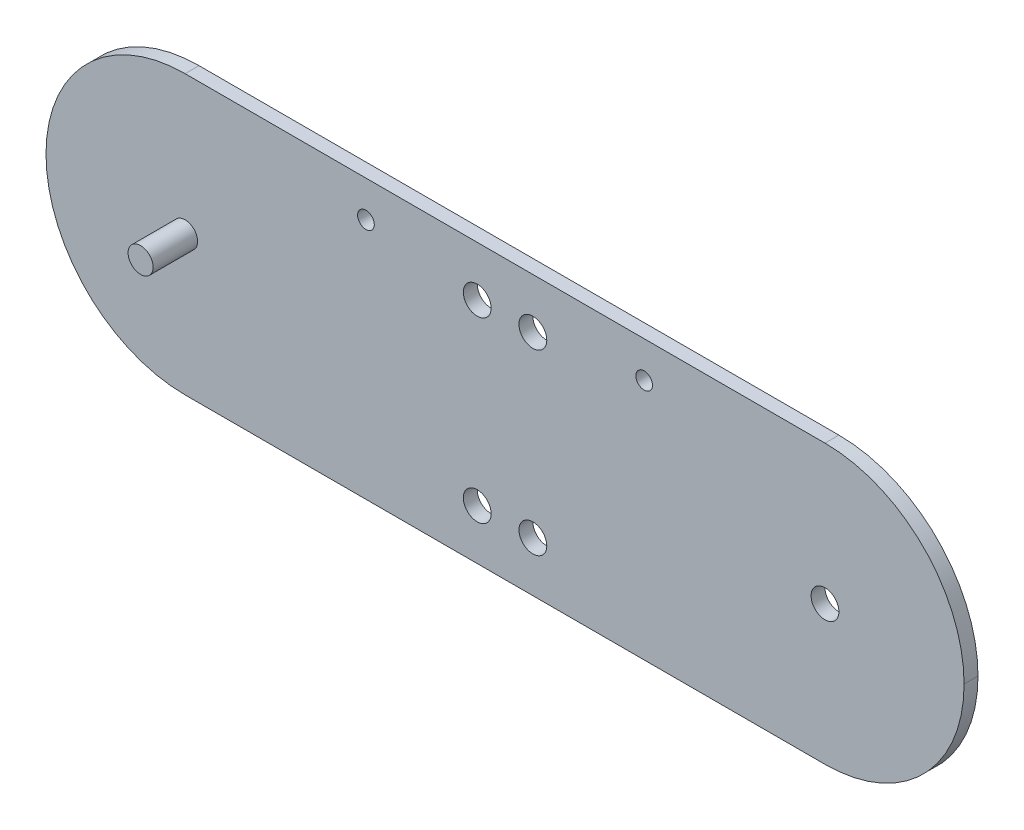
ISO-10303-21;
HEADER;
FILE_DESCRIPTION(('STEP AP214'),'2;1');
FILE_NAME('part.step','',(''),(''),'','','');
FILE_SCHEMA(('AUTOMOTIVE_DESIGN { 1 0 10303 214 1 1 1 1 }'));
ENDSEC;
DATA;
#1=APPLICATION_CONTEXT('core data for automotive mechanical design processes');
#2=APPLICATION_PROTOCOL_DEFINITION('international standard','automotive_design',2000,#1);
#3=PRODUCT_CONTEXT('',#1,'mechanical');
#4=PRODUCT('Part','Part','',(#3));
#5=PRODUCT_RELATED_PRODUCT_CATEGORY('part','',(#4));
#6=PRODUCT_DEFINITION_FORMATION('','',#4);
#7=PRODUCT_DEFINITION_CONTEXT('part definition',#1,'design');
#8=PRODUCT_DEFINITION('design','',#6,#7);
#9=PRODUCT_DEFINITION_SHAPE('','',#8);
#10=(LENGTH_UNIT() NAMED_UNIT(*) SI_UNIT(.MILLI.,.METRE.));
#11=(NAMED_UNIT(*) PLANE_ANGLE_UNIT() SI_UNIT($,.RADIAN.));
#12=(NAMED_UNIT(*) SI_UNIT($,.STERADIAN.) SOLID_ANGLE_UNIT());
#13=UNCERTAINTY_MEASURE_WITH_UNIT(LENGTH_MEASURE(1.E-05),#10,'distance_accuracy_value','');
#14=(GEOMETRIC_REPRESENTATION_CONTEXT(3) GLOBAL_UNCERTAINTY_ASSIGNED_CONTEXT((#13)) GLOBAL_UNIT_ASSIGNED_CONTEXT((#10,
#11,#12)) REPRESENTATION_CONTEXT('',''));
#15=CARTESIAN_POINT('',(0.,0.,0.));
#16=DIRECTION('',(0.,0.,1.));
#17=DIRECTION('',(1.,0.,0.));
#18=AXIS2_PLACEMENT_3D('',#15,#16,#17);
#19=CARTESIAN_POINT('',(82.5,-25.,2.5));
#20=DIRECTION('',(0.,1.,0.));
#21=DIRECTION('',(-1.,0.,0.));
#22=AXIS2_PLACEMENT_3D('',#19,#20,#21);
#23=PLANE('',#22);
#24=DIRECTION('',(1.,0.,0.));
#25=VECTOR('',#24,1.);
#26=CARTESIAN_POINT('',(82.5,-25.,2.5));
#27=LINE('',#26,#25);
#28=CARTESIAN_POINT('',(-57.5,-25.,2.5));
#29=VERTEX_POINT('',#28);
#30=CARTESIAN_POINT('',(57.5,-25.,2.5));
#31=VERTEX_POINT('',#30);
#32=EDGE_CURVE('E112',#29,#31,#27,.T.);
#33=ORIENTED_EDGE('',*,*,#32,.F.);
#34=DIRECTION('',(0.,0.,-1.));
#35=VECTOR('',#34,1.);
#36=CARTESIAN_POINT('',(-57.5,-25.,2.5));
#37=LINE('',#36,#35);
#38=CARTESIAN_POINT('',(-57.5,-25.,0.));
#39=VERTEX_POINT('',#38);
#40=EDGE_CURVE('E97',#29,#39,#37,.T.);
#41=ORIENTED_EDGE('',*,*,#40,.T.);
#42=DIRECTION('',(1.,0.,0.));
#43=VECTOR('',#42,1.);
#44=CARTESIAN_POINT('',(82.5,-25.,0.));
#45=LINE('',#44,#43);
#46=CARTESIAN_POINT('',(57.5,-25.,0.));
#47=VERTEX_POINT('',#46);
#48=EDGE_CURVE('E109',#39,#47,#45,.T.);
#49=ORIENTED_EDGE('',*,*,#48,.T.);
#50=DIRECTION('',(0.,0.,-1.));
#51=VECTOR('',#50,1.);
#52=CARTESIAN_POINT('',(57.5,-25.,2.5));
#53=LINE('',#52,#51);
#54=EDGE_CURVE('E114',#47,#31,#53,.F.);
#55=ORIENTED_EDGE('',*,*,#54,.T.);
#56=EDGE_LOOP('',(#33,#41,#49,#55));
#57=FACE_BOUND('',#56,.T.);
#58=ADVANCED_FACE('F40',(#57),#23,.F.);
#59=CARTESIAN_POINT('',(82.5,25.,2.5));
#60=DIRECTION('',(0.,-1.,0.));
#61=DIRECTION('',(1.,0.,0.));
#62=AXIS2_PLACEMENT_3D('',#59,#60,#61);
#63=PLANE('',#62);
#64=DIRECTION('',(-1.,0.,0.));
#65=VECTOR('',#64,1.);
#66=CARTESIAN_POINT('',(82.5,25.,0.));
#67=LINE('',#66,#65);
#68=CARTESIAN_POINT('',(57.5,25.,0.));
#69=VERTEX_POINT('',#68);
#70=CARTESIAN_POINT('',(-57.5,25.,0.));
#71=VERTEX_POINT('',#70);
#72=EDGE_CURVE('E119',#69,#71,#67,.T.);
#73=ORIENTED_EDGE('',*,*,#72,.T.);
#74=DIRECTION('',(0.,0.,-1.));
#75=VECTOR('',#74,1.);
#76=CARTESIAN_POINT('',(-57.5,25.,2.5));
#77=LINE('',#76,#75);
#78=CARTESIAN_POINT('',(-57.5,25.,2.5));
#79=VERTEX_POINT('',#78);
#80=EDGE_CURVE('E48',#71,#79,#77,.F.);
#81=ORIENTED_EDGE('',*,*,#80,.T.);
#82=DIRECTION('',(-1.,0.,0.));
#83=VECTOR('',#82,1.);
#84=CARTESIAN_POINT('',(82.5,25.,2.5));
#85=LINE('',#84,#83);
#86=CARTESIAN_POINT('',(57.5,25.,2.5));
#87=VERTEX_POINT('',#86);
#88=EDGE_CURVE('E125',#87,#79,#85,.T.);
#89=ORIENTED_EDGE('',*,*,#88,.F.);
#90=DIRECTION('',(0.,0.,-1.));
#91=VECTOR('',#90,1.);
#92=CARTESIAN_POINT('',(57.5,25.,2.5));
#93=LINE('',#92,#91);
#94=EDGE_CURVE('E139',#87,#69,#93,.T.);
#95=ORIENTED_EDGE('',*,*,#94,.T.);
#96=EDGE_LOOP('',(#73,#81,#89,#95));
#97=FACE_BOUND('',#96,.T.);
#98=ADVANCED_FACE('F169',(#97),#63,.F.);
#99=CARTESIAN_POINT('',(0.,0.,2.5));
#100=DIRECTION('',(0.,0.,-1.));
#101=DIRECTION('',(-1.,0.,0.));
#102=AXIS2_PLACEMENT_3D('',#99,#100,#101);
#103=PLANE('',#102);
#104=CARTESIAN_POINT('',(25.,18.5,2.5));
#105=DIRECTION('',(0.,0.,-1.));
#106=DIRECTION('',(-1.,0.,0.));
#107=AXIS2_PLACEMENT_3D('',#104,#105,#106);
#108=CIRCLE('',#107,1.5);
#109=CARTESIAN_POINT('',(23.5,18.5,2.5));
#110=VERTEX_POINT('',#109);
#111=EDGE_CURVE('E241',#110,#110,#108,.T.);
#112=ORIENTED_EDGE('',*,*,#111,.T.);
#113=EDGE_LOOP('',(#112));
#114=FACE_BOUND('',#113,.T.);
#115=CARTESIAN_POINT('',(-25.,18.5,2.5));
#116=DIRECTION('',(0.,0.,-1.));
#117=DIRECTION('',(-1.,0.,0.));
#118=AXIS2_PLACEMENT_3D('',#115,#116,#117);
#119=CIRCLE('',#118,1.5);
#120=CARTESIAN_POINT('',(-26.5,18.5,2.5));
#121=VERTEX_POINT('',#120);
#122=EDGE_CURVE('E243',#121,#121,#119,.T.);
#123=ORIENTED_EDGE('',*,*,#122,.T.);
#124=EDGE_LOOP('',(#123));
#125=FACE_BOUND('',#124,.T.);
#126=CARTESIAN_POINT('',(-57.5,0.,2.5));
#127=DIRECTION('',(0.,0.,-1.));
#128=DIRECTION('',(-1.,0.,0.));
#129=AXIS2_PLACEMENT_3D('',#126,#127,#128);
#130=CIRCLE('',#129,2.25);
#131=CARTESIAN_POINT('',(-59.75,0.,2.5));
#132=VERTEX_POINT('',#131);
#133=EDGE_CURVE('E12',#132,#132,#130,.F.);
#134=ORIENTED_EDGE('',*,*,#133,.F.);
#135=EDGE_LOOP('',(#134));
#136=FACE_BOUND('',#135,.T.);
#137=CARTESIAN_POINT('',(57.5,0.,2.5));
#138=DIRECTION('',(0.,0.,-1.));
#139=DIRECTION('',(-1.,0.,0.));
#140=AXIS2_PLACEMENT_3D('',#137,#138,#139);
#141=CIRCLE('',#140,2.5);
#142=CARTESIAN_POINT('',(55.,0.,2.5));
#143=VERTEX_POINT('',#142);
#144=EDGE_CURVE('E252',#143,#143,#141,.T.);
#145=ORIENTED_EDGE('',*,*,#144,.T.);
#146=EDGE_LOOP('',(#145));
#147=FACE_BOUND('',#146,.T.);
#148=CARTESIAN_POINT('',(-5.,-16.,2.5));
#149=DIRECTION('',(0.,0.,-1.));
#150=DIRECTION('',(1.,0.,0.));
#151=AXIS2_PLACEMENT_3D('',#148,#149,#150);
#152=CIRCLE('',#151,2.5);
#153=CARTESIAN_POINT('',(-2.5,-16.,2.5));
#154=VERTEX_POINT('',#153);
#155=EDGE_CURVE('E259',#154,#154,#152,.T.);
#156=ORIENTED_EDGE('',*,*,#155,.T.);
#157=EDGE_LOOP('',(#156));
#158=FACE_BOUND('',#157,.T.);
#159=CARTESIAN_POINT('',(5.,-16.,2.5));
#160=DIRECTION('',(0.,0.,-1.));
#161=DIRECTION('',(1.,0.,0.));
#162=AXIS2_PLACEMENT_3D('',#159,#160,#161);
#163=CIRCLE('',#162,2.5);
#164=CARTESIAN_POINT('',(7.5,-16.,2.5));
#165=VERTEX_POINT('',#164);
#166=EDGE_CURVE('E154',#165,#165,#163,.T.);
#167=ORIENTED_EDGE('',*,*,#166,.T.);
#168=EDGE_LOOP('',(#167));
#169=FACE_BOUND('',#168,.T.);
#170=CARTESIAN_POINT('',(-5.,16.,2.5));
#171=DIRECTION('',(0.,0.,1.));
#172=DIRECTION('',(1.,0.,0.));
#173=AXIS2_PLACEMENT_3D('',#170,#171,#172);
#174=CIRCLE('',#173,2.5);
#175=CARTESIAN_POINT('',(-2.5,16.,2.5));
#176=VERTEX_POINT('',#175);
#177=EDGE_CURVE('E146',#176,#176,#174,.T.);
#178=ORIENTED_EDGE('',*,*,#177,.F.);
#179=EDGE_LOOP('',(#178));
#180=FACE_BOUND('',#179,.T.);
#181=CARTESIAN_POINT('',(5.,16.,2.5));
#182=DIRECTION('',(0.,0.,1.));
#183=DIRECTION('',(1.,0.,0.));
#184=AXIS2_PLACEMENT_3D('',#181,#182,#183);
#185=CIRCLE('',#184,2.5);
#186=CARTESIAN_POINT('',(7.5,16.,2.5));
#187=VERTEX_POINT('',#186);
#188=EDGE_CURVE('E159',#187,#187,#185,.T.);
#189=ORIENTED_EDGE('',*,*,#188,.F.);
#190=EDGE_LOOP('',(#189));
#191=FACE_BOUND('',#190,.T.);
#192=CARTESIAN_POINT('',(-57.5,0.,2.5));
#193=DIRECTION('',(0.,0.,-1.));
#194=DIRECTION('',(-1.,0.,0.));
#195=AXIS2_PLACEMENT_3D('',#192,#193,#194);
#196=CIRCLE('',#195,25.);
#197=CARTESIAN_POINT('',(-82.5,0.,2.5));
#198=VERTEX_POINT('',#197);
#199=EDGE_CURVE('E135',#79,#198,#196,.F.);
#200=ORIENTED_EDGE('',*,*,#199,.T.);
#201=CARTESIAN_POINT('',(-57.5,0.,2.5));
#202=DIRECTION('',(0.,0.,-1.));
#203=DIRECTION('',(-1.,0.,0.));
#204=AXIS2_PLACEMENT_3D('',#201,#202,#203);
#205=CIRCLE('',#204,25.);
#206=EDGE_CURVE('E137',#198,#29,#205,.F.);
#207=ORIENTED_EDGE('',*,*,#206,.T.);
#208=ORIENTED_EDGE('',*,*,#32,.T.);
#209=CARTESIAN_POINT('',(57.5,0.,2.5));
#210=DIRECTION('',(0.,0.,-1.));
#211=DIRECTION('',(-1.,0.,0.));
#212=AXIS2_PLACEMENT_3D('',#209,#210,#211);
#213=CIRCLE('',#212,25.);
#214=CARTESIAN_POINT('',(82.5,0.,2.5));
#215=VERTEX_POINT('',#214);
#216=EDGE_CURVE('E133',#31,#215,#213,.F.);
#217=ORIENTED_EDGE('',*,*,#216,.T.);
#218=CARTESIAN_POINT('',(57.5,0.,2.5));
#219=DIRECTION('',(0.,0.,-1.));
#220=DIRECTION('',(-1.,0.,0.));
#221=AXIS2_PLACEMENT_3D('',#218,#219,#220);
#222=CIRCLE('',#221,25.);
#223=EDGE_CURVE('E61',#215,#87,#222,.F.);
#224=ORIENTED_EDGE('',*,*,#223,.T.);
#225=ORIENTED_EDGE('',*,*,#88,.T.);
#226=EDGE_LOOP('',(#200,#207,#208,#217,#224,#225));
#227=FACE_BOUND('',#226,.T.);
#228=ADVANCED_FACE('F163',(#114,#125,#136,#147,#158,#169,#180,#191,#227),#103,.F.);
#229=CARTESIAN_POINT('',(0.,0.,0.));
#230=DIRECTION('',(0.,0.,-1.));
#231=DIRECTION('',(-1.,0.,0.));
#232=AXIS2_PLACEMENT_3D('',#229,#230,#231);
#233=PLANE('',#232);
#234=CARTESIAN_POINT('',(25.,18.5,0.));
#235=DIRECTION('',(0.,0.,-1.));
#236=DIRECTION('',(-1.,0.,0.));
#237=AXIS2_PLACEMENT_3D('',#234,#235,#236);
#238=CIRCLE('',#237,1.5);
#239=CARTESIAN_POINT('',(23.5,18.5,0.));
#240=VERTEX_POINT('',#239);
#241=EDGE_CURVE('E238',#240,#240,#238,.T.);
#242=ORIENTED_EDGE('',*,*,#241,.F.);
#243=EDGE_LOOP('',(#242));
#244=FACE_BOUND('',#243,.T.);
#245=CARTESIAN_POINT('',(-25.,18.5,0.));
#246=DIRECTION('',(0.,0.,-1.));
#247=DIRECTION('',(-1.,0.,0.));
#248=AXIS2_PLACEMENT_3D('',#245,#246,#247);
#249=CIRCLE('',#248,1.5);
#250=CARTESIAN_POINT('',(-26.5,18.5,0.));
#251=VERTEX_POINT('',#250);
#252=EDGE_CURVE('E287',#251,#251,#249,.T.);
#253=ORIENTED_EDGE('',*,*,#252,.F.);
#254=EDGE_LOOP('',(#253));
#255=FACE_BOUND('',#254,.T.);
#256=CARTESIAN_POINT('',(57.5,0.,0.));
#257=DIRECTION('',(0.,0.,-1.));
#258=DIRECTION('',(-1.,0.,0.));
#259=AXIS2_PLACEMENT_3D('',#256,#257,#258);
#260=CIRCLE('',#259,2.5);
#261=CARTESIAN_POINT('',(55.,0.,0.));
#262=VERTEX_POINT('',#261);
#263=EDGE_CURVE('E246',#262,#262,#260,.T.);
#264=ORIENTED_EDGE('',*,*,#263,.F.);
#265=EDGE_LOOP('',(#264));
#266=FACE_BOUND('',#265,.T.);
#267=CARTESIAN_POINT('',(-5.,-16.,0.));
#268=DIRECTION('',(0.,0.,-1.));
#269=DIRECTION('',(1.,0.,0.));
#270=AXIS2_PLACEMENT_3D('',#267,#268,#269);
#271=CIRCLE('',#270,2.5);
#272=CARTESIAN_POINT('',(-2.5,-16.,0.));
#273=VERTEX_POINT('',#272);
#274=EDGE_CURVE('E161',#273,#273,#271,.T.);
#275=ORIENTED_EDGE('',*,*,#274,.F.);
#276=EDGE_LOOP('',(#275));
#277=FACE_BOUND('',#276,.T.);
#278=CARTESIAN_POINT('',(5.,-16.,0.));
#279=DIRECTION('',(0.,0.,-1.));
#280=DIRECTION('',(1.,0.,0.));
#281=AXIS2_PLACEMENT_3D('',#278,#279,#280);
#282=CIRCLE('',#281,2.5);
#283=CARTESIAN_POINT('',(7.5,-16.,0.));
#284=VERTEX_POINT('',#283);
#285=EDGE_CURVE('E261',#284,#284,#282,.T.);
#286=ORIENTED_EDGE('',*,*,#285,.F.);
#287=EDGE_LOOP('',(#286));
#288=FACE_BOUND('',#287,.T.);
#289=CARTESIAN_POINT('',(-5.,16.,0.));
#290=DIRECTION('',(0.,0.,1.));
#291=DIRECTION('',(1.,0.,0.));
#292=AXIS2_PLACEMENT_3D('',#289,#290,#291);
#293=CIRCLE('',#292,2.5);
#294=CARTESIAN_POINT('',(-2.5,16.,0.));
#295=VERTEX_POINT('',#294);
#296=EDGE_CURVE('E142',#295,#295,#293,.T.);
#297=ORIENTED_EDGE('',*,*,#296,.T.);
#298=EDGE_LOOP('',(#297));
#299=FACE_BOUND('',#298,.T.);
#300=CARTESIAN_POINT('',(5.,16.,0.));
#301=DIRECTION('',(0.,0.,1.));
#302=DIRECTION('',(1.,0.,0.));
#303=AXIS2_PLACEMENT_3D('',#300,#301,#302);
#304=CIRCLE('',#303,2.5);
#305=CARTESIAN_POINT('',(7.5,16.,0.));
#306=VERTEX_POINT('',#305);
#307=EDGE_CURVE('E151',#306,#306,#304,.T.);
#308=ORIENTED_EDGE('',*,*,#307,.T.);
#309=EDGE_LOOP('',(#308));
#310=FACE_BOUND('',#309,.T.);
#311=ORIENTED_EDGE('',*,*,#48,.F.);
#312=CARTESIAN_POINT('',(-57.5,0.,0.));
#313=DIRECTION('',(0.,0.,-1.));
#314=DIRECTION('',(-1.,0.,0.));
#315=AXIS2_PLACEMENT_3D('',#312,#313,#314);
#316=CIRCLE('',#315,25.);
#317=CARTESIAN_POINT('',(-82.5,0.,0.));
#318=VERTEX_POINT('',#317);
#319=EDGE_CURVE('E93',#39,#318,#316,.T.);
#320=ORIENTED_EDGE('',*,*,#319,.T.);
#321=CARTESIAN_POINT('',(-57.5,0.,0.));
#322=DIRECTION('',(0.,0.,-1.));
#323=DIRECTION('',(-1.,0.,0.));
#324=AXIS2_PLACEMENT_3D('',#321,#322,#323);
#325=CIRCLE('',#324,25.);
#326=EDGE_CURVE('E103',#318,#71,#325,.T.);
#327=ORIENTED_EDGE('',*,*,#326,.T.);
#328=ORIENTED_EDGE('',*,*,#72,.F.);
#329=CARTESIAN_POINT('',(57.5,0.,0.));
#330=DIRECTION('',(0.,0.,-1.));
#331=DIRECTION('',(-1.,0.,0.));
#332=AXIS2_PLACEMENT_3D('',#329,#330,#331);
#333=CIRCLE('',#332,25.);
#334=CARTESIAN_POINT('',(82.5,0.,0.));
#335=VERTEX_POINT('',#334);
#336=EDGE_CURVE('E113',#69,#335,#333,.T.);
#337=ORIENTED_EDGE('',*,*,#336,.T.);
#338=CARTESIAN_POINT('',(57.5,0.,0.));
#339=DIRECTION('',(0.,0.,-1.));
#340=DIRECTION('',(-1.,0.,0.));
#341=AXIS2_PLACEMENT_3D('',#338,#339,#340);
#342=CIRCLE('',#341,25.);
#343=EDGE_CURVE('E118',#335,#47,#342,.T.);
#344=ORIENTED_EDGE('',*,*,#343,.T.);
#345=EDGE_LOOP('',(#311,#320,#327,#328,#337,#344));
#346=FACE_BOUND('',#345,.T.);
#347=ADVANCED_FACE('F116',(#244,#255,#266,#277,#288,#299,#310,#346),#233,.T.);
#348=CARTESIAN_POINT('',(-57.5,0.,2.5));
#349=DIRECTION('',(0.,0.,-1.));
#350=DIRECTION('',(-1.,0.,0.));
#351=AXIS2_PLACEMENT_3D('',#348,#349,#350);
#352=CYLINDRICAL_SURFACE('',#351,25.);
#353=DIRECTION('',(0.,0.,-1.));
#354=VECTOR('',#353,1.);
#355=CARTESIAN_POINT('',(-82.5,0.,2.5));
#356=LINE('',#355,#354);
#357=EDGE_CURVE('E99',#198,#318,#356,.T.);
#358=ORIENTED_EDGE('',*,*,#357,.F.);
#359=ORIENTED_EDGE('',*,*,#199,.F.);
#360=ORIENTED_EDGE('',*,*,#80,.F.);
#361=ORIENTED_EDGE('',*,*,#326,.F.);
#362=EDGE_LOOP('',(#358,#359,#360,#361));
#363=FACE_BOUND('',#362,.T.);
#364=ADVANCED_FACE('F166',(#363),#352,.T.);
#365=CARTESIAN_POINT('',(-57.5,0.,2.5));
#366=DIRECTION('',(0.,0.,-1.));
#367=DIRECTION('',(-1.,0.,0.));
#368=AXIS2_PLACEMENT_3D('',#365,#366,#367);
#369=CYLINDRICAL_SURFACE('',#368,25.);
#370=ORIENTED_EDGE('',*,*,#206,.F.);
#371=ORIENTED_EDGE('',*,*,#357,.T.);
#372=ORIENTED_EDGE('',*,*,#319,.F.);
#373=ORIENTED_EDGE('',*,*,#40,.F.);
#374=EDGE_LOOP('',(#370,#371,#372,#373));
#375=FACE_BOUND('',#374,.T.);
#376=ADVANCED_FACE('F96',(#375),#369,.T.);
#377=CARTESIAN_POINT('',(57.5,0.,2.5));
#378=DIRECTION('',(0.,0.,-1.));
#379=DIRECTION('',(-1.,0.,0.));
#380=AXIS2_PLACEMENT_3D('',#377,#378,#379);
#381=CYLINDRICAL_SURFACE('',#380,25.);
#382=ORIENTED_EDGE('',*,*,#94,.F.);
#383=ORIENTED_EDGE('',*,*,#223,.F.);
#384=DIRECTION('',(0.,0.,-1.));
#385=VECTOR('',#384,1.);
#386=CARTESIAN_POINT('',(82.5,0.,2.5));
#387=LINE('',#386,#385);
#388=EDGE_CURVE('E122',#335,#215,#387,.F.);
#389=ORIENTED_EDGE('',*,*,#388,.F.);
#390=ORIENTED_EDGE('',*,*,#336,.F.);
#391=EDGE_LOOP('',(#382,#383,#389,#390));
#392=FACE_BOUND('',#391,.T.);
#393=ADVANCED_FACE('F42',(#392),#381,.T.);
#394=CARTESIAN_POINT('',(57.5,0.,2.5));
#395=DIRECTION('',(0.,0.,-1.));
#396=DIRECTION('',(-1.,0.,0.));
#397=AXIS2_PLACEMENT_3D('',#394,#395,#396);
#398=CYLINDRICAL_SURFACE('',#397,25.);
#399=ORIENTED_EDGE('',*,*,#216,.F.);
#400=ORIENTED_EDGE('',*,*,#54,.F.);
#401=ORIENTED_EDGE('',*,*,#343,.F.);
#402=ORIENTED_EDGE('',*,*,#388,.T.);
#403=EDGE_LOOP('',(#399,#400,#401,#402));
#404=FACE_BOUND('',#403,.T.);
#405=ADVANCED_FACE('F171',(#404),#398,.T.);
#406=CARTESIAN_POINT('',(5.,16.,0.));
#407=DIRECTION('',(0.,0.,1.));
#408=DIRECTION('',(1.,0.,0.));
#409=AXIS2_PLACEMENT_3D('',#406,#407,#408);
#410=CYLINDRICAL_SURFACE('',#409,2.5);
#411=ORIENTED_EDGE('',*,*,#307,.F.);
#412=EDGE_LOOP('',(#411));
#413=FACE_BOUND('',#412,.T.);
#414=ORIENTED_EDGE('',*,*,#188,.T.);
#415=EDGE_LOOP('',(#414));
#416=FACE_BOUND('',#415,.T.);
#417=ADVANCED_FACE('F173',(#413,#416),#410,.F.);
#418=CARTESIAN_POINT('',(-5.,16.,0.));
#419=DIRECTION('',(0.,0.,1.));
#420=DIRECTION('',(1.,0.,0.));
#421=AXIS2_PLACEMENT_3D('',#418,#419,#420);
#422=CYLINDRICAL_SURFACE('',#421,2.5);
#423=ORIENTED_EDGE('',*,*,#296,.F.);
#424=EDGE_LOOP('',(#423));
#425=FACE_BOUND('',#424,.T.);
#426=ORIENTED_EDGE('',*,*,#177,.T.);
#427=EDGE_LOOP('',(#426));
#428=FACE_BOUND('',#427,.T.);
#429=ADVANCED_FACE('F178',(#425,#428),#422,.F.);
#430=CARTESIAN_POINT('',(5.,-16.,0.));
#431=DIRECTION('',(0.,0.,1.));
#432=DIRECTION('',(1.,0.,0.));
#433=AXIS2_PLACEMENT_3D('',#430,#431,#432);
#434=CYLINDRICAL_SURFACE('',#433,2.5);
#435=ORIENTED_EDGE('',*,*,#285,.T.);
#436=EDGE_LOOP('',(#435));
#437=FACE_BOUND('',#436,.T.);
#438=ORIENTED_EDGE('',*,*,#166,.F.);
#439=EDGE_LOOP('',(#438));
#440=FACE_BOUND('',#439,.T.);
#441=ADVANCED_FACE('F206',(#437,#440),#434,.F.);
#442=CARTESIAN_POINT('',(-5.,-16.,0.));
#443=DIRECTION('',(0.,0.,1.));
#444=DIRECTION('',(1.,0.,0.));
#445=AXIS2_PLACEMENT_3D('',#442,#443,#444);
#446=CYLINDRICAL_SURFACE('',#445,2.5);
#447=ORIENTED_EDGE('',*,*,#274,.T.);
#448=EDGE_LOOP('',(#447));
#449=FACE_BOUND('',#448,.T.);
#450=ORIENTED_EDGE('',*,*,#155,.F.);
#451=EDGE_LOOP('',(#450));
#452=FACE_BOUND('',#451,.T.);
#453=ADVANCED_FACE('F210',(#449,#452),#446,.F.);
#454=CARTESIAN_POINT('',(57.5,0.,2.5));
#455=DIRECTION('',(0.,0.,-1.));
#456=DIRECTION('',(-1.,0.,0.));
#457=AXIS2_PLACEMENT_3D('',#454,#455,#456);
#458=CYLINDRICAL_SURFACE('',#457,2.5);
#459=ORIENTED_EDGE('',*,*,#144,.F.);
#460=EDGE_LOOP('',(#459));
#461=FACE_BOUND('',#460,.T.);
#462=ORIENTED_EDGE('',*,*,#263,.T.);
#463=EDGE_LOOP('',(#462));
#464=FACE_BOUND('',#463,.T.);
#465=ADVANCED_FACE('F214',(#461,#464),#458,.F.);
#466=CARTESIAN_POINT('',(-57.5,0.,10.5));
#467=DIRECTION('',(0.,0.,-1.));
#468=DIRECTION('',(-1.,0.,0.));
#469=AXIS2_PLACEMENT_3D('',#466,#467,#468);
#470=CYLINDRICAL_SURFACE('',#469,2.25);
#471=CARTESIAN_POINT('',(-57.5,0.,10.5));
#472=DIRECTION('',(0.,0.,1.));
#473=DIRECTION('',(1.,0.,0.));
#474=AXIS2_PLACEMENT_3D('',#471,#472,#473);
#475=CIRCLE('',#474,2.25);
#476=CARTESIAN_POINT('',(-55.25,0.,10.5));
#477=VERTEX_POINT('',#476);
#478=EDGE_CURVE('E242',#477,#477,#475,.T.);
#479=ORIENTED_EDGE('',*,*,#478,.F.);
#480=EDGE_LOOP('',(#479));
#481=FACE_BOUND('',#480,.T.);
#482=ORIENTED_EDGE('',*,*,#133,.T.);
#483=EDGE_LOOP('',(#482));
#484=FACE_BOUND('',#483,.T.);
#485=ADVANCED_FACE('F218',(#481,#484),#470,.T.);
#486=CARTESIAN_POINT('',(0.,0.,10.5));
#487=DIRECTION('',(0.,0.,1.));
#488=DIRECTION('',(1.,0.,0.));
#489=AXIS2_PLACEMENT_3D('',#486,#487,#488);
#490=PLANE('',#489);
#491=ORIENTED_EDGE('',*,*,#478,.T.);
#492=EDGE_LOOP('',(#491));
#493=FACE_BOUND('',#492,.T.);
#494=ADVANCED_FACE('F222',(#493),#490,.T.);
#495=CARTESIAN_POINT('',(-25.,18.5,10.5));
#496=DIRECTION('',(0.,0.,-1.));
#497=DIRECTION('',(-1.,0.,0.));
#498=AXIS2_PLACEMENT_3D('',#495,#496,#497);
#499=CYLINDRICAL_SURFACE('',#498,1.5);
#500=CARTESIAN_POINT('',(-26.5,18.5,0.));
#501=CARTESIAN_POINT('',(-26.5,18.5,0.0260416666666667));
#502=CARTESIAN_POINT('',(-26.5,18.5,0.0520833333333334));
#503=CARTESIAN_POINT('',(-26.5,18.5,0.104166666666667));
#504=CARTESIAN_POINT('',(-26.5,18.5,0.130208333333333));
#505=CARTESIAN_POINT('',(-26.5,18.5,0.182291666666667));
#506=CARTESIAN_POINT('',(-26.5,18.5,0.208333333333334));
#507=CARTESIAN_POINT('',(-26.5,18.5,0.260416666666667));
#508=CARTESIAN_POINT('',(-26.5,18.5,0.286458333333334));
#509=CARTESIAN_POINT('',(-26.5,18.5,0.338541666666667));
#510=CARTESIAN_POINT('',(-26.5,18.5,0.364583333333334));
#511=CARTESIAN_POINT('',(-26.5,18.5,0.416666666666667));
#512=CARTESIAN_POINT('',(-26.5,18.5,0.442708333333334));
#513=CARTESIAN_POINT('',(-26.5,18.5,0.494791666666667));
#514=CARTESIAN_POINT('',(-26.5,18.5,0.520833333333334));
#515=CARTESIAN_POINT('',(-26.5,18.5,0.572916666666667));
#516=CARTESIAN_POINT('',(-26.5,18.5,0.598958333333334));
#517=CARTESIAN_POINT('',(-26.5,18.5,0.651041666666667));
#518=CARTESIAN_POINT('',(-26.5,18.5,0.677083333333334));
#519=CARTESIAN_POINT('',(-26.5,18.5,0.729166666666667));
#520=CARTESIAN_POINT('',(-26.5,18.5,0.755208333333334));
#521=CARTESIAN_POINT('',(-26.5,18.5,0.807291666666667));
#522=CARTESIAN_POINT('',(-26.5,18.5,0.833333333333334));
#523=CARTESIAN_POINT('',(-26.5,18.5,0.885416666666668));
#524=CARTESIAN_POINT('',(-26.5,18.5,0.911458333333334));
#525=CARTESIAN_POINT('',(-26.5,18.5,0.963541666666668));
#526=CARTESIAN_POINT('',(-26.5,18.5,0.989583333333334));
#527=CARTESIAN_POINT('',(-26.5,18.5,1.04166666666667));
#528=CARTESIAN_POINT('',(-26.5,18.5,1.06770833333333));
#529=CARTESIAN_POINT('',(-26.5,18.5,1.11979166666667));
#530=CARTESIAN_POINT('',(-26.5,18.5,1.14583333333333));
#531=CARTESIAN_POINT('',(-26.5,18.5,1.19791666666667));
#532=CARTESIAN_POINT('',(-26.5,18.5,1.22395833333333));
#533=CARTESIAN_POINT('',(-26.5,18.5,1.27604166666667));
#534=CARTESIAN_POINT('',(-26.5,18.5,1.30208333333333));
#535=CARTESIAN_POINT('',(-26.5,18.5,1.35416666666667));
#536=CARTESIAN_POINT('',(-26.5,18.5,1.38020833333333));
#537=CARTESIAN_POINT('',(-26.5,18.5,1.43229166666667));
#538=CARTESIAN_POINT('',(-26.5,18.5,1.45833333333333));
#539=CARTESIAN_POINT('',(-26.5,18.5,1.51041666666667));
#540=CARTESIAN_POINT('',(-26.5,18.5,1.53645833333333));
#541=CARTESIAN_POINT('',(-26.5,18.5,1.58854166666667));
#542=CARTESIAN_POINT('',(-26.5,18.5,1.61458333333333));
#543=CARTESIAN_POINT('',(-26.5,18.5,1.66666666666667));
#544=CARTESIAN_POINT('',(-26.5,18.5,1.69270833333333));
#545=CARTESIAN_POINT('',(-26.5,18.5,1.74479166666667));
#546=CARTESIAN_POINT('',(-26.5,18.5,1.77083333333334));
#547=CARTESIAN_POINT('',(-26.5,18.5,1.82291666666667));
#548=CARTESIAN_POINT('',(-26.5,18.5,1.84895833333334));
#549=CARTESIAN_POINT('',(-26.5,18.5,1.90104166666667));
#550=CARTESIAN_POINT('',(-26.5,18.5,1.92708333333334));
#551=CARTESIAN_POINT('',(-26.5,18.5,1.97916666666667));
#552=CARTESIAN_POINT('',(-26.5,18.5,2.00520833333333));
#553=CARTESIAN_POINT('',(-26.5,18.5,2.05729166666667));
#554=CARTESIAN_POINT('',(-26.5,18.5,2.08333333333334));
#555=CARTESIAN_POINT('',(-26.5,18.5,2.13541666666667));
#556=CARTESIAN_POINT('',(-26.5,18.5,2.16145833333334));
#557=CARTESIAN_POINT('',(-26.5,18.5,2.21354166666667));
#558=CARTESIAN_POINT('',(-26.5,18.5,2.23958333333334));
#559=CARTESIAN_POINT('',(-26.5,18.5,2.29166666666667));
#560=CARTESIAN_POINT('',(-26.5,18.5,2.31770833333334));
#561=CARTESIAN_POINT('',(-26.5,18.5,2.36979166666667));
#562=CARTESIAN_POINT('',(-26.5,18.5,2.39583333333334));
#563=CARTESIAN_POINT('',(-26.5,18.5,2.44791666666667));
#564=CARTESIAN_POINT('',(-26.5,18.5,2.47395833333334));
#565=CARTESIAN_POINT('',(-26.5,18.5,2.5));
#566=B_SPLINE_CURVE_WITH_KNOTS('',3,(#500,#501,#502,#503,#504,#505,#506,#507,#508,#509,#510,
#511,#512,#513,#514,#515,#516,#517,#518,#519,#520,#521,#522,#523,#524,#525,#526,#527,#528,#529,
#530,#531,#532,#533,#534,#535,#536,#537,#538,#539,#540,#541,#542,#543,#544,#545,#546,#547,#548,
#549,#550,#551,#552,#553,#554,#555,#556,#557,#558,#559,#560,#561,#562,#563,#564,#565),
.UNSPECIFIED.,.F.,.F.,(4,2,2,2,2,2,2,2,2,2,2,2,2,2,2,2,2,2,2,2,2,2,2,2,2,2,2,2,2,2,2,2,4),(0.,
0.0781250000000001,0.15625,0.234375,0.3125,0.390625,0.46875,0.546875,0.625000000000001,
0.703125000000001,0.781250000000001,0.859375000000001,0.937500000000001,1.015625,1.09375,
1.171875,1.25,1.328125,1.40625,1.484375,1.5625,1.640625,1.71875,1.796875,1.875,1.953125,2.03125,
2.109375,2.1875,2.265625,2.34375,2.421875,2.5),.UNSPECIFIED.);
#567=EDGE_CURVE('BSEAM226',#251,#121,#566,.T.);
#568=ORIENTED_EDGE('',*,*,#252,.T.);
#569=ORIENTED_EDGE('',*,*,#122,.F.);
#570=ORIENTED_EDGE('',*,*,#567,.T.);
#571=ORIENTED_EDGE('',*,*,#567,.F.);
#572=EDGE_LOOP('',(#568,#570,#569,#571));
#573=FACE_BOUND('',#572,.T.);
#574=ADVANCED_FACE('F226',(#573),#499,.F.);
#575=CARTESIAN_POINT('',(25.,18.5,10.5));
#576=DIRECTION('',(0.,0.,-1.));
#577=DIRECTION('',(-1.,0.,0.));
#578=AXIS2_PLACEMENT_3D('',#575,#576,#577);
#579=CYLINDRICAL_SURFACE('',#578,1.5);
#580=CARTESIAN_POINT('',(23.5,18.5,0.));
#581=CARTESIAN_POINT('',(23.5,18.5,0.0260416666666667));
#582=CARTESIAN_POINT('',(23.5,18.5,0.0520833333333334));
#583=CARTESIAN_POINT('',(23.5,18.5,0.104166666666667));
#584=CARTESIAN_POINT('',(23.5,18.5,0.130208333333333));
#585=CARTESIAN_POINT('',(23.5,18.5,0.182291666666667));
#586=CARTESIAN_POINT('',(23.5,18.5,0.208333333333334));
#587=CARTESIAN_POINT('',(23.5,18.5,0.260416666666667));
#588=CARTESIAN_POINT('',(23.5,18.5,0.286458333333334));
#589=CARTESIAN_POINT('',(23.5,18.5,0.338541666666667));
#590=CARTESIAN_POINT('',(23.5,18.5,0.364583333333334));
#591=CARTESIAN_POINT('',(23.5,18.5,0.416666666666667));
#592=CARTESIAN_POINT('',(23.5,18.5,0.442708333333334));
#593=CARTESIAN_POINT('',(23.5,18.5,0.494791666666667));
#594=CARTESIAN_POINT('',(23.5,18.5,0.520833333333334));
#595=CARTESIAN_POINT('',(23.5,18.5,0.572916666666667));
#596=CARTESIAN_POINT('',(23.5,18.5,0.598958333333334));
#597=CARTESIAN_POINT('',(23.5,18.5,0.651041666666667));
#598=CARTESIAN_POINT('',(23.5,18.5,0.677083333333334));
#599=CARTESIAN_POINT('',(23.5,18.5,0.729166666666667));
#600=CARTESIAN_POINT('',(23.5,18.5,0.755208333333334));
#601=CARTESIAN_POINT('',(23.5,18.5,0.807291666666667));
#602=CARTESIAN_POINT('',(23.5,18.5,0.833333333333334));
#603=CARTESIAN_POINT('',(23.5,18.5,0.885416666666668));
#604=CARTESIAN_POINT('',(23.5,18.5,0.911458333333334));
#605=CARTESIAN_POINT('',(23.5,18.5,0.963541666666668));
#606=CARTESIAN_POINT('',(23.5,18.5,0.989583333333334));
#607=CARTESIAN_POINT('',(23.5,18.5,1.04166666666667));
#608=CARTESIAN_POINT('',(23.5,18.5,1.06770833333333));
#609=CARTESIAN_POINT('',(23.5,18.5,1.11979166666667));
#610=CARTESIAN_POINT('',(23.5,18.5,1.14583333333333));
#611=CARTESIAN_POINT('',(23.5,18.5,1.19791666666667));
#612=CARTESIAN_POINT('',(23.5,18.5,1.22395833333333));
#613=CARTESIAN_POINT('',(23.5,18.5,1.27604166666667));
#614=CARTESIAN_POINT('',(23.5,18.5,1.30208333333333));
#615=CARTESIAN_POINT('',(23.5,18.5,1.35416666666667));
#616=CARTESIAN_POINT('',(23.5,18.5,1.38020833333333));
#617=CARTESIAN_POINT('',(23.5,18.5,1.43229166666667));
#618=CARTESIAN_POINT('',(23.5,18.5,1.45833333333333));
#619=CARTESIAN_POINT('',(23.5,18.5,1.51041666666667));
#620=CARTESIAN_POINT('',(23.5,18.5,1.53645833333333));
#621=CARTESIAN_POINT('',(23.5,18.5,1.58854166666667));
#622=CARTESIAN_POINT('',(23.5,18.5,1.61458333333333));
#623=CARTESIAN_POINT('',(23.5,18.5,1.66666666666667));
#624=CARTESIAN_POINT('',(23.5,18.5,1.69270833333333));
#625=CARTESIAN_POINT('',(23.5,18.5,1.74479166666667));
#626=CARTESIAN_POINT('',(23.5,18.5,1.77083333333334));
#627=CARTESIAN_POINT('',(23.5,18.5,1.82291666666667));
#628=CARTESIAN_POINT('',(23.5,18.5,1.84895833333334));
#629=CARTESIAN_POINT('',(23.5,18.5,1.90104166666667));
#630=CARTESIAN_POINT('',(23.5,18.5,1.92708333333334));
#631=CARTESIAN_POINT('',(23.5,18.5,1.97916666666667));
#632=CARTESIAN_POINT('',(23.5,18.5,2.00520833333333));
#633=CARTESIAN_POINT('',(23.5,18.5,2.05729166666667));
#634=CARTESIAN_POINT('',(23.5,18.5,2.08333333333334));
#635=CARTESIAN_POINT('',(23.5,18.5,2.13541666666667));
#636=CARTESIAN_POINT('',(23.5,18.5,2.16145833333334));
#637=CARTESIAN_POINT('',(23.5,18.5,2.21354166666667));
#638=CARTESIAN_POINT('',(23.5,18.5,2.23958333333334));
#639=CARTESIAN_POINT('',(23.5,18.5,2.29166666666667));
#640=CARTESIAN_POINT('',(23.5,18.5,2.31770833333334));
#641=CARTESIAN_POINT('',(23.5,18.5,2.36979166666667));
#642=CARTESIAN_POINT('',(23.5,18.5,2.39583333333334));
#643=CARTESIAN_POINT('',(23.5,18.5,2.44791666666667));
#644=CARTESIAN_POINT('',(23.5,18.5,2.47395833333334));
#645=CARTESIAN_POINT('',(23.5,18.5,2.5));
#646=B_SPLINE_CURVE_WITH_KNOTS('',3,(#580,#581,#582,#583,#584,#585,#586,#587,#588,#589,#590,
#591,#592,#593,#594,#595,#596,#597,#598,#599,#600,#601,#602,#603,#604,#605,#606,#607,#608,#609,
#610,#611,#612,#613,#614,#615,#616,#617,#618,#619,#620,#621,#622,#623,#624,#625,#626,#627,#628,
#629,#630,#631,#632,#633,#634,#635,#636,#637,#638,#639,#640,#641,#642,#643,#644,#645),
.UNSPECIFIED.,.F.,.F.,(4,2,2,2,2,2,2,2,2,2,2,2,2,2,2,2,2,2,2,2,2,2,2,2,2,2,2,2,2,2,2,2,4),(0.,
0.0781250000000001,0.15625,0.234375,0.3125,0.390625,0.46875,0.546875,0.625000000000001,
0.703125000000001,0.781250000000001,0.859375000000001,0.937500000000001,1.015625,1.09375,
1.171875,1.25,1.328125,1.40625,1.484375,1.5625,1.640625,1.71875,1.796875,1.875,1.953125,2.03125,
2.109375,2.1875,2.265625,2.34375,2.421875,2.5),.UNSPECIFIED.);
#647=EDGE_CURVE('BSEAM230',#240,#110,#646,.T.);
#648=ORIENTED_EDGE('',*,*,#241,.T.);
#649=ORIENTED_EDGE('',*,*,#111,.F.);
#650=ORIENTED_EDGE('',*,*,#647,.T.);
#651=ORIENTED_EDGE('',*,*,#647,.F.);
#652=EDGE_LOOP('',(#648,#650,#649,#651));
#653=FACE_BOUND('',#652,.T.);
#654=ADVANCED_FACE('F230',(#653),#579,.F.);
#655=CLOSED_SHELL('',(#58,#98,#228,#347,#364,#376,#393,#405,#417,#429,#441,#453,#465,#485,#494,
#574,#654));
#656=MANIFOLD_SOLID_BREP('B2',#655);
#657=ADVANCED_BREP_SHAPE_REPRESENTATION('',(#18,#656),#14);
#658=SHAPE_DEFINITION_REPRESENTATION(#9,#657);
ENDSEC;
END-ISO-10303-21;
